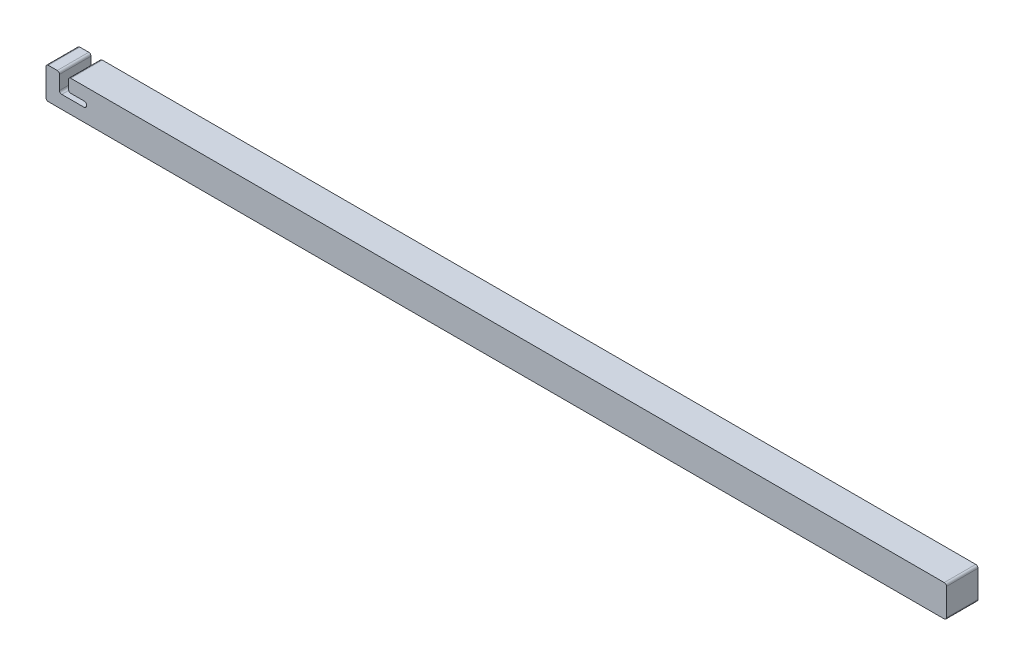
ISO-10303-21;
HEADER;
FILE_DESCRIPTION(('STEP AP214'),'2;1');
FILE_NAME('part.step','',(''),(''),'','','');
FILE_SCHEMA(('AUTOMOTIVE_DESIGN { 1 0 10303 214 1 1 1 1 }'));
ENDSEC;
DATA;
#1=APPLICATION_CONTEXT('core data for automotive mechanical design processes');
#2=APPLICATION_PROTOCOL_DEFINITION('international standard','automotive_design',2000,#1);
#3=PRODUCT_CONTEXT('',#1,'mechanical');
#4=PRODUCT('Part','Part','',(#3));
#5=PRODUCT_RELATED_PRODUCT_CATEGORY('part','',(#4));
#6=PRODUCT_DEFINITION_FORMATION('','',#4);
#7=PRODUCT_DEFINITION_CONTEXT('part definition',#1,'design');
#8=PRODUCT_DEFINITION('design','',#6,#7);
#9=PRODUCT_DEFINITION_SHAPE('','',#8);
#10=(LENGTH_UNIT() NAMED_UNIT(*) SI_UNIT(.MILLI.,.METRE.));
#11=(NAMED_UNIT(*) PLANE_ANGLE_UNIT() SI_UNIT($,.RADIAN.));
#12=(NAMED_UNIT(*) SI_UNIT($,.STERADIAN.) SOLID_ANGLE_UNIT());
#13=UNCERTAINTY_MEASURE_WITH_UNIT(LENGTH_MEASURE(1.E-05),#10,'distance_accuracy_value','');
#14=(GEOMETRIC_REPRESENTATION_CONTEXT(3) GLOBAL_UNCERTAINTY_ASSIGNED_CONTEXT((#13)) GLOBAL_UNIT_ASSIGNED_CONTEXT((#10,
#11,#12)) REPRESENTATION_CONTEXT('',''));
#15=CARTESIAN_POINT('',(0.,0.,0.));
#16=DIRECTION('',(0.,0.,1.));
#17=DIRECTION('',(1.,0.,0.));
#18=AXIS2_PLACEMENT_3D('',#15,#16,#17);
#19=CARTESIAN_POINT('',(-100.,3.5,7.));
#20=DIRECTION('',(0.,-1.,0.));
#21=DIRECTION('',(0.,0.,-1.));
#22=AXIS2_PLACEMENT_3D('',#19,#20,#21);
#23=PLANE('',#22);
#24=DIRECTION('',(-1.,0.,0.));
#25=VECTOR('',#24,1.);
#26=CARTESIAN_POINT('',(-100.,3.5,7.));
#27=LINE('',#26,#25);
#28=CARTESIAN_POINT('',(99.5,3.5,7.));
#29=VERTEX_POINT('',#28);
#30=CARTESIAN_POINT('',(-94.5,3.5,7.));
#31=VERTEX_POINT('',#30);
#32=EDGE_CURVE('E331',#29,#31,#27,.T.);
#33=ORIENTED_EDGE('',*,*,#32,.F.);
#34=DIRECTION('',(0.,0.,-1.));
#35=VECTOR('',#34,1.);
#36=CARTESIAN_POINT('',(99.5,3.5,7.));
#37=LINE('',#36,#35);
#38=CARTESIAN_POINT('',(99.5,3.5,0.));
#39=VERTEX_POINT('',#38);
#40=EDGE_CURVE('E244',#29,#39,#37,.T.);
#41=ORIENTED_EDGE('',*,*,#40,.T.);
#42=DIRECTION('',(-1.,0.,0.));
#43=VECTOR('',#42,1.);
#44=CARTESIAN_POINT('',(-100.,3.5,0.));
#45=LINE('',#44,#43);
#46=CARTESIAN_POINT('',(-94.5,3.5,0.));
#47=VERTEX_POINT('',#46);
#48=EDGE_CURVE('E201',#39,#47,#45,.T.);
#49=ORIENTED_EDGE('',*,*,#48,.T.);
#50=DIRECTION('',(0.,0.,1.));
#51=VECTOR('',#50,1.);
#52=CARTESIAN_POINT('',(-94.5,3.5,7.));
#53=LINE('',#52,#51);
#54=EDGE_CURVE('E241',#47,#31,#53,.T.);
#55=ORIENTED_EDGE('',*,*,#54,.T.);
#56=EDGE_LOOP('',(#33,#41,#49,#55));
#57=FACE_BOUND('',#56,.T.);
#58=ADVANCED_FACE('F33',(#57),#23,.F.);
#59=CARTESIAN_POINT('',(-97.5,3.5,7.));
#60=VERTEX_POINT('',#59);
#61=CARTESIAN_POINT('',(-99.5,3.5,7.));
#62=VERTEX_POINT('',#61);
#63=EDGE_CURVE('E330',#60,#62,#27,.T.);
#64=ORIENTED_EDGE('',*,*,#63,.F.);
#65=DIRECTION('',(0.,0.,1.));
#66=VECTOR('',#65,1.);
#67=CARTESIAN_POINT('',(-97.5,3.5,0.));
#68=LINE('',#67,#66);
#69=CARTESIAN_POINT('',(-97.5,3.5,0.));
#70=VERTEX_POINT('',#69);
#71=EDGE_CURVE('E278',#60,#70,#68,.F.);
#72=ORIENTED_EDGE('',*,*,#71,.T.);
#73=CARTESIAN_POINT('',(-99.5,3.5,0.));
#74=VERTEX_POINT('',#73);
#75=EDGE_CURVE('E197',#70,#74,#45,.T.);
#76=ORIENTED_EDGE('',*,*,#75,.T.);
#77=DIRECTION('',(0.,0.,-1.));
#78=VECTOR('',#77,1.);
#79=CARTESIAN_POINT('',(-99.5,3.5,7.));
#80=LINE('',#79,#78);
#81=EDGE_CURVE('E276',#74,#62,#80,.F.);
#82=ORIENTED_EDGE('',*,*,#81,.T.);
#83=EDGE_LOOP('',(#64,#72,#76,#82));
#84=FACE_BOUND('',#83,.T.);
#85=ADVANCED_FACE('F359',(#84),#23,.F.);
#86=CARTESIAN_POINT('',(0.,0.,7.));
#87=DIRECTION('',(0.,0.,1.));
#88=DIRECTION('',(1.,0.,0.));
#89=AXIS2_PLACEMENT_3D('',#86,#87,#88);
#90=PLANE('',#89);
#91=DIRECTION('',(1.,0.,0.));
#92=VECTOR('',#91,1.);
#93=CARTESIAN_POINT('',(-100.,-3.5,7.));
#94=LINE('',#93,#92);
#95=CARTESIAN_POINT('',(-99.5,-3.5,7.));
#96=VERTEX_POINT('',#95);
#97=CARTESIAN_POINT('',(99.5,-3.5,7.));
#98=VERTEX_POINT('',#97);
#99=EDGE_CURVE('E207',#96,#98,#94,.T.);
#100=ORIENTED_EDGE('',*,*,#99,.T.);
#101=CARTESIAN_POINT('',(99.5,-3.,7.));
#102=DIRECTION('',(0.,0.,1.));
#103=DIRECTION('',(1.,0.,0.));
#104=AXIS2_PLACEMENT_3D('',#101,#102,#103);
#105=CIRCLE('',#104,0.5);
#106=CARTESIAN_POINT('',(100.,-3.,7.));
#107=VERTEX_POINT('',#106);
#108=EDGE_CURVE('E239',#98,#107,#105,.T.);
#109=ORIENTED_EDGE('',*,*,#108,.T.);
#110=DIRECTION('',(0.,1.,0.));
#111=VECTOR('',#110,1.);
#112=CARTESIAN_POINT('',(100.,3.5,7.));
#113=LINE('',#112,#111);
#114=CARTESIAN_POINT('',(100.,3.,7.));
#115=VERTEX_POINT('',#114);
#116=EDGE_CURVE('E191',#107,#115,#113,.T.);
#117=ORIENTED_EDGE('',*,*,#116,.T.);
#118=CARTESIAN_POINT('',(99.5,3.,7.));
#119=DIRECTION('',(0.,0.,1.));
#120=DIRECTION('',(1.,0.,0.));
#121=AXIS2_PLACEMENT_3D('',#118,#119,#120);
#122=CIRCLE('',#121,0.5);
#123=EDGE_CURVE('E237',#115,#29,#122,.T.);
#124=ORIENTED_EDGE('',*,*,#123,.T.);
#125=ORIENTED_EDGE('',*,*,#32,.T.);
#126=CARTESIAN_POINT('',(-94.5,3.,7.));
#127=DIRECTION('',(0.,0.,1.));
#128=DIRECTION('',(1.,0.,0.));
#129=AXIS2_PLACEMENT_3D('',#126,#127,#128);
#130=CIRCLE('',#129,0.5);
#131=CARTESIAN_POINT('',(-95.,3.,7.));
#132=VERTEX_POINT('',#131);
#133=EDGE_CURVE('E231',#31,#132,#130,.T.);
#134=ORIENTED_EDGE('',*,*,#133,.T.);
#135=DIRECTION('',(0.,-1.,0.));
#136=VECTOR('',#135,1.);
#137=CARTESIAN_POINT('',(-95.,0.6,7.));
#138=LINE('',#137,#136);
#139=CARTESIAN_POINT('',(-95.,1.1,7.));
#140=VERTEX_POINT('',#139);
#141=EDGE_CURVE('E319',#132,#140,#138,.T.);
#142=ORIENTED_EDGE('',*,*,#141,.T.);
#143=CARTESIAN_POINT('',(-94.5,1.1,7.));
#144=DIRECTION('',(0.,0.,1.));
#145=DIRECTION('',(1.,0.,0.));
#146=AXIS2_PLACEMENT_3D('',#143,#144,#145);
#147=CIRCLE('',#146,0.5);
#148=CARTESIAN_POINT('',(-94.5,0.6,7.));
#149=VERTEX_POINT('',#148);
#150=EDGE_CURVE('E233',#140,#149,#147,.T.);
#151=ORIENTED_EDGE('',*,*,#150,.T.);
#152=DIRECTION('',(1.,0.,0.));
#153=VECTOR('',#152,1.);
#154=CARTESIAN_POINT('',(-91.,0.599999999999998,7.));
#155=LINE('',#154,#153);
#156=CARTESIAN_POINT('',(-91.5,0.599999999999998,7.));
#157=VERTEX_POINT('',#156);
#158=EDGE_CURVE('E322',#149,#157,#155,.T.);
#159=ORIENTED_EDGE('',*,*,#158,.T.);
#160=CARTESIAN_POINT('',(-91.5,0.0999999999999983,7.));
#161=DIRECTION('',(0.,0.,1.));
#162=DIRECTION('',(1.,0.,0.));
#163=AXIS2_PLACEMENT_3D('',#160,#161,#162);
#164=CIRCLE('',#163,0.5);
#165=CARTESIAN_POINT('',(-91.,0.0999999999999983,7.));
#166=VERTEX_POINT('',#165);
#167=EDGE_CURVE('E280',#157,#166,#164,.F.);
#168=ORIENTED_EDGE('',*,*,#167,.T.);
#169=DIRECTION('',(0.,-1.,0.));
#170=VECTOR('',#169,1.);
#171=CARTESIAN_POINT('',(-91.,-0.600000000000001,7.));
#172=LINE('',#171,#170);
#173=CARTESIAN_POINT('',(-91.,-0.100000000000001,7.));
#174=VERTEX_POINT('',#173);
#175=EDGE_CURVE('E325',#166,#174,#172,.T.);
#176=ORIENTED_EDGE('',*,*,#175,.T.);
#177=CARTESIAN_POINT('',(-91.5,-0.100000000000001,7.));
#178=DIRECTION('',(0.,0.,1.));
#179=DIRECTION('',(1.,0.,0.));
#180=AXIS2_PLACEMENT_3D('',#177,#178,#179);
#181=CIRCLE('',#180,0.5);
#182=CARTESIAN_POINT('',(-91.5,-0.600000000000001,7.));
#183=VERTEX_POINT('',#182);
#184=EDGE_CURVE('E284',#174,#183,#181,.F.);
#185=ORIENTED_EDGE('',*,*,#184,.T.);
#186=DIRECTION('',(-1.,0.,0.));
#187=VECTOR('',#186,1.);
#188=CARTESIAN_POINT('',(-97.,-0.600000000000001,7.));
#189=LINE('',#188,#187);
#190=CARTESIAN_POINT('',(-96.5,-0.600000000000001,7.));
#191=VERTEX_POINT('',#190);
#192=EDGE_CURVE('E294',#183,#191,#189,.T.);
#193=ORIENTED_EDGE('',*,*,#192,.T.);
#194=CARTESIAN_POINT('',(-96.5,-0.100000000000001,7.));
#195=DIRECTION('',(0.,0.,1.));
#196=DIRECTION('',(1.,0.,0.));
#197=AXIS2_PLACEMENT_3D('',#194,#195,#196);
#198=CIRCLE('',#197,0.5);
#199=CARTESIAN_POINT('',(-97.,-0.100000000000001,7.));
#200=VERTEX_POINT('',#199);
#201=EDGE_CURVE('E41',#191,#200,#198,.F.);
#202=ORIENTED_EDGE('',*,*,#201,.T.);
#203=DIRECTION('',(0.,1.,0.));
#204=VECTOR('',#203,1.);
#205=CARTESIAN_POINT('',(-97.,3.5,7.));
#206=LINE('',#205,#204);
#207=CARTESIAN_POINT('',(-97.,3.,7.));
#208=VERTEX_POINT('',#207);
#209=EDGE_CURVE('E292',#200,#208,#206,.T.);
#210=ORIENTED_EDGE('',*,*,#209,.T.);
#211=CARTESIAN_POINT('',(-97.5,3.,7.));
#212=DIRECTION('',(0.,0.,1.));
#213=DIRECTION('',(1.,0.,0.));
#214=AXIS2_PLACEMENT_3D('',#211,#212,#213);
#215=CIRCLE('',#214,0.5);
#216=EDGE_CURVE('E229',#208,#60,#215,.T.);
#217=ORIENTED_EDGE('',*,*,#216,.T.);
#218=ORIENTED_EDGE('',*,*,#63,.T.);
#219=CARTESIAN_POINT('',(-99.5,3.,7.));
#220=DIRECTION('',(0.,0.,1.));
#221=DIRECTION('',(1.,0.,0.));
#222=AXIS2_PLACEMENT_3D('',#219,#220,#221);
#223=CIRCLE('',#222,0.5);
#224=CARTESIAN_POINT('',(-100.,3.,7.));
#225=VERTEX_POINT('',#224);
#226=EDGE_CURVE('E55',#62,#225,#223,.T.);
#227=ORIENTED_EDGE('',*,*,#226,.T.);
#228=DIRECTION('',(0.,-1.,0.));
#229=VECTOR('',#228,1.);
#230=CARTESIAN_POINT('',(-100.,3.5,7.));
#231=LINE('',#230,#229);
#232=CARTESIAN_POINT('',(-100.,-3.,7.));
#233=VERTEX_POINT('',#232);
#234=EDGE_CURVE('E332',#225,#233,#231,.T.);
#235=ORIENTED_EDGE('',*,*,#234,.T.);
#236=CARTESIAN_POINT('',(-99.5,-3.,7.));
#237=DIRECTION('',(0.,0.,1.));
#238=DIRECTION('',(1.,0.,0.));
#239=AXIS2_PLACEMENT_3D('',#236,#237,#238);
#240=CIRCLE('',#239,0.5);
#241=EDGE_CURVE('E235',#233,#96,#240,.T.);
#242=ORIENTED_EDGE('',*,*,#241,.T.);
#243=EDGE_LOOP('',(#100,#109,#117,#124,#125,#134,#142,#151,#159,#168,#176,#185,#193,#202,#210,
#217,#218,#227,#235,#242));
#244=FACE_BOUND('',#243,.T.);
#245=ADVANCED_FACE('F291',(#244),#90,.T.);
#246=CARTESIAN_POINT('',(0.,0.,0.));
#247=DIRECTION('',(0.,0.,1.));
#248=DIRECTION('',(1.,0.,0.));
#249=AXIS2_PLACEMENT_3D('',#246,#247,#248);
#250=PLANE('',#249);
#251=DIRECTION('',(0.,1.,0.));
#252=VECTOR('',#251,1.);
#253=CARTESIAN_POINT('',(100.,3.5,0.));
#254=LINE('',#253,#252);
#255=CARTESIAN_POINT('',(100.,-3.,0.));
#256=VERTEX_POINT('',#255);
#257=CARTESIAN_POINT('',(100.,3.,0.));
#258=VERTEX_POINT('',#257);
#259=EDGE_CURVE('E188',#256,#258,#254,.T.);
#260=ORIENTED_EDGE('',*,*,#259,.F.);
#261=CARTESIAN_POINT('',(99.5,-3.,0.));
#262=DIRECTION('',(0.,0.,1.));
#263=DIRECTION('',(1.,0.,0.));
#264=AXIS2_PLACEMENT_3D('',#261,#262,#263);
#265=CIRCLE('',#264,0.5);
#266=CARTESIAN_POINT('',(99.5,-3.5,0.));
#267=VERTEX_POINT('',#266);
#268=EDGE_CURVE('E171',#256,#267,#265,.F.);
#269=ORIENTED_EDGE('',*,*,#268,.T.);
#270=DIRECTION('',(1.,0.,0.));
#271=VECTOR('',#270,1.);
#272=CARTESIAN_POINT('',(-100.,-3.5,0.));
#273=LINE('',#272,#271);
#274=CARTESIAN_POINT('',(-99.5,-3.5,0.));
#275=VERTEX_POINT('',#274);
#276=EDGE_CURVE('E212',#275,#267,#273,.T.);
#277=ORIENTED_EDGE('',*,*,#276,.F.);
#278=CARTESIAN_POINT('',(-99.5,-3.,0.));
#279=DIRECTION('',(0.,0.,1.));
#280=DIRECTION('',(1.,0.,0.));
#281=AXIS2_PLACEMENT_3D('',#278,#279,#280);
#282=CIRCLE('',#281,0.5);
#283=CARTESIAN_POINT('',(-100.,-3.,0.));
#284=VERTEX_POINT('',#283);
#285=EDGE_CURVE('E222',#275,#284,#282,.F.);
#286=ORIENTED_EDGE('',*,*,#285,.T.);
#287=DIRECTION('',(0.,-1.,0.));
#288=VECTOR('',#287,1.);
#289=CARTESIAN_POINT('',(-100.,3.5,0.));
#290=LINE('',#289,#288);
#291=CARTESIAN_POINT('',(-100.,3.,0.));
#292=VERTEX_POINT('',#291);
#293=EDGE_CURVE('E210',#292,#284,#290,.T.);
#294=ORIENTED_EDGE('',*,*,#293,.F.);
#295=CARTESIAN_POINT('',(-99.5,3.,0.));
#296=DIRECTION('',(0.,0.,1.));
#297=DIRECTION('',(1.,0.,0.));
#298=AXIS2_PLACEMENT_3D('',#295,#296,#297);
#299=CIRCLE('',#298,0.5);
#300=EDGE_CURVE('E192',#292,#74,#299,.F.);
#301=ORIENTED_EDGE('',*,*,#300,.T.);
#302=ORIENTED_EDGE('',*,*,#75,.F.);
#303=CARTESIAN_POINT('',(-97.5,3.,0.));
#304=DIRECTION('',(0.,0.,1.));
#305=DIRECTION('',(1.,0.,0.));
#306=AXIS2_PLACEMENT_3D('',#303,#304,#305);
#307=CIRCLE('',#306,0.5);
#308=CARTESIAN_POINT('',(-97.,3.,0.));
#309=VERTEX_POINT('',#308);
#310=EDGE_CURVE('E216',#70,#309,#307,.F.);
#311=ORIENTED_EDGE('',*,*,#310,.T.);
#312=DIRECTION('',(0.,1.,0.));
#313=VECTOR('',#312,1.);
#314=CARTESIAN_POINT('',(-97.,3.5,0.));
#315=LINE('',#314,#313);
#316=CARTESIAN_POINT('',(-97.,-0.100000000000001,0.));
#317=VERTEX_POINT('',#316);
#318=EDGE_CURVE('E198',#317,#309,#315,.T.);
#319=ORIENTED_EDGE('',*,*,#318,.F.);
#320=CARTESIAN_POINT('',(-96.5,-0.100000000000001,0.));
#321=DIRECTION('',(0.,0.,1.));
#322=DIRECTION('',(1.,0.,0.));
#323=AXIS2_PLACEMENT_3D('',#320,#321,#322);
#324=CIRCLE('',#323,0.5);
#325=CARTESIAN_POINT('',(-96.5,-0.600000000000001,0.));
#326=VERTEX_POINT('',#325);
#327=EDGE_CURVE('E11',#317,#326,#324,.T.);
#328=ORIENTED_EDGE('',*,*,#327,.T.);
#329=DIRECTION('',(-1.,0.,0.));
#330=VECTOR('',#329,1.);
#331=CARTESIAN_POINT('',(-97.,-0.600000000000001,0.));
#332=LINE('',#331,#330);
#333=CARTESIAN_POINT('',(-91.5,-0.600000000000001,0.));
#334=VERTEX_POINT('',#333);
#335=EDGE_CURVE('E204',#334,#326,#332,.T.);
#336=ORIENTED_EDGE('',*,*,#335,.F.);
#337=CARTESIAN_POINT('',(-91.5,-0.100000000000001,0.));
#338=DIRECTION('',(0.,0.,1.));
#339=DIRECTION('',(1.,0.,0.));
#340=AXIS2_PLACEMENT_3D('',#337,#338,#339);
#341=CIRCLE('',#340,0.5);
#342=CARTESIAN_POINT('',(-91.,-0.100000000000001,0.));
#343=VERTEX_POINT('',#342);
#344=EDGE_CURVE('E286',#334,#343,#341,.T.);
#345=ORIENTED_EDGE('',*,*,#344,.T.);
#346=DIRECTION('',(0.,-1.,0.));
#347=VECTOR('',#346,1.);
#348=CARTESIAN_POINT('',(-91.,-0.600000000000001,0.));
#349=LINE('',#348,#347);
#350=CARTESIAN_POINT('',(-91.,0.0999999999999983,0.));
#351=VERTEX_POINT('',#350);
#352=EDGE_CURVE('E312',#351,#343,#349,.T.);
#353=ORIENTED_EDGE('',*,*,#352,.F.);
#354=CARTESIAN_POINT('',(-91.5,0.0999999999999983,0.));
#355=DIRECTION('',(0.,0.,1.));
#356=DIRECTION('',(1.,0.,0.));
#357=AXIS2_PLACEMENT_3D('',#354,#355,#356);
#358=CIRCLE('',#357,0.5);
#359=CARTESIAN_POINT('',(-91.5,0.599999999999998,0.));
#360=VERTEX_POINT('',#359);
#361=EDGE_CURVE('E282',#351,#360,#358,.T.);
#362=ORIENTED_EDGE('',*,*,#361,.T.);
#363=DIRECTION('',(1.,0.,0.));
#364=VECTOR('',#363,1.);
#365=CARTESIAN_POINT('',(-91.,0.599999999999998,0.));
#366=LINE('',#365,#364);
#367=CARTESIAN_POINT('',(-94.5,0.6,0.));
#368=VERTEX_POINT('',#367);
#369=EDGE_CURVE('E315',#368,#360,#366,.T.);
#370=ORIENTED_EDGE('',*,*,#369,.F.);
#371=CARTESIAN_POINT('',(-94.5,1.1,0.));
#372=DIRECTION('',(0.,0.,1.));
#373=DIRECTION('',(1.,0.,0.));
#374=AXIS2_PLACEMENT_3D('',#371,#372,#373);
#375=CIRCLE('',#374,0.5);
#376=CARTESIAN_POINT('',(-95.,1.1,0.));
#377=VERTEX_POINT('',#376);
#378=EDGE_CURVE('E220',#368,#377,#375,.F.);
#379=ORIENTED_EDGE('',*,*,#378,.T.);
#380=DIRECTION('',(0.,-1.,0.));
#381=VECTOR('',#380,1.);
#382=CARTESIAN_POINT('',(-95.,0.6,0.));
#383=LINE('',#382,#381);
#384=CARTESIAN_POINT('',(-95.,3.,0.));
#385=VERTEX_POINT('',#384);
#386=EDGE_CURVE('E302',#385,#377,#383,.T.);
#387=ORIENTED_EDGE('',*,*,#386,.F.);
#388=CARTESIAN_POINT('',(-94.5,3.,0.));
#389=DIRECTION('',(0.,0.,1.));
#390=DIRECTION('',(1.,0.,0.));
#391=AXIS2_PLACEMENT_3D('',#388,#389,#390);
#392=CIRCLE('',#391,0.5);
#393=EDGE_CURVE('E218',#385,#47,#392,.F.);
#394=ORIENTED_EDGE('',*,*,#393,.T.);
#395=ORIENTED_EDGE('',*,*,#48,.F.);
#396=CARTESIAN_POINT('',(99.5,3.,0.));
#397=DIRECTION('',(0.,0.,1.));
#398=DIRECTION('',(1.,0.,0.));
#399=AXIS2_PLACEMENT_3D('',#396,#397,#398);
#400=CIRCLE('',#399,0.5);
#401=EDGE_CURVE('E182',#39,#258,#400,.F.);
#402=ORIENTED_EDGE('',*,*,#401,.T.);
#403=EDGE_LOOP('',(#260,#269,#277,#286,#294,#301,#302,#311,#319,#328,#336,#345,#353,#362,#370,
#379,#387,#394,#395,#402));
#404=FACE_BOUND('',#403,.T.);
#405=ADVANCED_FACE('F195',(#404),#250,.F.);
#406=CARTESIAN_POINT('',(100.,3.5,7.));
#407=DIRECTION('',(-1.,0.,0.));
#408=DIRECTION('',(0.,0.,1.));
#409=AXIS2_PLACEMENT_3D('',#406,#407,#408);
#410=PLANE('',#409);
#411=ORIENTED_EDGE('',*,*,#116,.F.);
#412=DIRECTION('',(0.,0.,-1.));
#413=VECTOR('',#412,1.);
#414=CARTESIAN_POINT('',(100.,-3.,7.));
#415=LINE('',#414,#413);
#416=EDGE_CURVE('E175',#107,#256,#415,.T.);
#417=ORIENTED_EDGE('',*,*,#416,.T.);
#418=ORIENTED_EDGE('',*,*,#259,.T.);
#419=DIRECTION('',(0.,0.,-1.));
#420=VECTOR('',#419,1.);
#421=CARTESIAN_POINT('',(100.,3.,7.));
#422=LINE('',#421,#420);
#423=EDGE_CURVE('E193',#258,#115,#422,.F.);
#424=ORIENTED_EDGE('',*,*,#423,.T.);
#425=EDGE_LOOP('',(#411,#417,#418,#424));
#426=FACE_BOUND('',#425,.T.);
#427=ADVANCED_FACE('F187',(#426),#410,.F.);
#428=CARTESIAN_POINT('',(-100.,3.5,7.));
#429=DIRECTION('',(1.,0.,0.));
#430=DIRECTION('',(0.,0.,-1.));
#431=AXIS2_PLACEMENT_3D('',#428,#429,#430);
#432=PLANE('',#431);
#433=ORIENTED_EDGE('',*,*,#293,.T.);
#434=DIRECTION('',(0.,0.,-1.));
#435=VECTOR('',#434,1.);
#436=CARTESIAN_POINT('',(-100.,-3.,7.));
#437=LINE('',#436,#435);
#438=EDGE_CURVE('E48',#284,#233,#437,.F.);
#439=ORIENTED_EDGE('',*,*,#438,.T.);
#440=ORIENTED_EDGE('',*,*,#234,.F.);
#441=DIRECTION('',(0.,0.,-1.));
#442=VECTOR('',#441,1.);
#443=CARTESIAN_POINT('',(-100.,3.,7.));
#444=LINE('',#443,#442);
#445=EDGE_CURVE('E247',#225,#292,#444,.T.);
#446=ORIENTED_EDGE('',*,*,#445,.T.);
#447=EDGE_LOOP('',(#433,#439,#440,#446));
#448=FACE_BOUND('',#447,.T.);
#449=ADVANCED_FACE('F351',(#448),#432,.F.);
#450=CARTESIAN_POINT('',(-100.,-3.5,7.));
#451=DIRECTION('',(0.,1.,0.));
#452=DIRECTION('',(0.,0.,1.));
#453=AXIS2_PLACEMENT_3D('',#450,#451,#452);
#454=PLANE('',#453);
#455=ORIENTED_EDGE('',*,*,#276,.T.);
#456=DIRECTION('',(0.,0.,-1.));
#457=VECTOR('',#456,1.);
#458=CARTESIAN_POINT('',(99.5,-3.5,7.));
#459=LINE('',#458,#457);
#460=EDGE_CURVE('E176',#267,#98,#459,.F.);
#461=ORIENTED_EDGE('',*,*,#460,.T.);
#462=ORIENTED_EDGE('',*,*,#99,.F.);
#463=DIRECTION('',(0.,0.,-1.));
#464=VECTOR('',#463,1.);
#465=CARTESIAN_POINT('',(-99.5,-3.5,7.));
#466=LINE('',#465,#464);
#467=EDGE_CURVE('E181',#96,#275,#466,.T.);
#468=ORIENTED_EDGE('',*,*,#467,.T.);
#469=EDGE_LOOP('',(#455,#461,#462,#468));
#470=FACE_BOUND('',#469,.T.);
#471=ADVANCED_FACE('F347',(#470),#454,.F.);
#472=CARTESIAN_POINT('',(-95.,0.6,0.));
#473=DIRECTION('',(-1.,0.,0.));
#474=DIRECTION('',(0.,0.,1.));
#475=AXIS2_PLACEMENT_3D('',#472,#473,#474);
#476=PLANE('',#475);
#477=ORIENTED_EDGE('',*,*,#386,.T.);
#478=DIRECTION('',(0.,0.,1.));
#479=VECTOR('',#478,1.);
#480=CARTESIAN_POINT('',(-95.,1.1,0.));
#481=LINE('',#480,#479);
#482=EDGE_CURVE('E253',#377,#140,#481,.T.);
#483=ORIENTED_EDGE('',*,*,#482,.T.);
#484=ORIENTED_EDGE('',*,*,#141,.F.);
#485=DIRECTION('',(0.,0.,1.));
#486=VECTOR('',#485,1.);
#487=CARTESIAN_POINT('',(-95.,3.,0.));
#488=LINE('',#487,#486);
#489=EDGE_CURVE('E251',#132,#385,#488,.F.);
#490=ORIENTED_EDGE('',*,*,#489,.T.);
#491=EDGE_LOOP('',(#477,#483,#484,#490));
#492=FACE_BOUND('',#491,.T.);
#493=ADVANCED_FACE('F483',(#492),#476,.T.);
#494=CARTESIAN_POINT('',(-91.,0.599999999999998,0.));
#495=DIRECTION('',(0.,-1.,0.));
#496=DIRECTION('',(1.,0.,0.));
#497=AXIS2_PLACEMENT_3D('',#494,#495,#496);
#498=PLANE('',#497);
#499=ORIENTED_EDGE('',*,*,#158,.F.);
#500=DIRECTION('',(0.,0.,1.));
#501=VECTOR('',#500,1.);
#502=CARTESIAN_POINT('',(-94.5,0.6,0.));
#503=LINE('',#502,#501);
#504=EDGE_CURVE('E259',#149,#368,#503,.F.);
#505=ORIENTED_EDGE('',*,*,#504,.T.);
#506=ORIENTED_EDGE('',*,*,#369,.T.);
#507=DIRECTION('',(0.,0.,1.));
#508=VECTOR('',#507,1.);
#509=CARTESIAN_POINT('',(-91.5,0.599999999999998,7.));
#510=LINE('',#509,#508);
#511=EDGE_CURVE('E256',#360,#157,#510,.T.);
#512=ORIENTED_EDGE('',*,*,#511,.T.);
#513=EDGE_LOOP('',(#499,#505,#506,#512));
#514=FACE_BOUND('',#513,.T.);
#515=ADVANCED_FACE('F474',(#514),#498,.T.);
#516=CARTESIAN_POINT('',(-91.,-0.600000000000001,0.));
#517=DIRECTION('',(-1.,0.,0.));
#518=DIRECTION('',(0.,0.,1.));
#519=AXIS2_PLACEMENT_3D('',#516,#517,#518);
#520=PLANE('',#519);
#521=ORIENTED_EDGE('',*,*,#175,.F.);
#522=DIRECTION('',(0.,0.,1.));
#523=VECTOR('',#522,1.);
#524=CARTESIAN_POINT('',(-91.,0.0999999999999983,0.));
#525=LINE('',#524,#523);
#526=EDGE_CURVE('E264',#166,#351,#525,.F.);
#527=ORIENTED_EDGE('',*,*,#526,.T.);
#528=ORIENTED_EDGE('',*,*,#352,.T.);
#529=DIRECTION('',(0.,0.,1.));
#530=VECTOR('',#529,1.);
#531=CARTESIAN_POINT('',(-91.,-0.100000000000001,7.));
#532=LINE('',#531,#530);
#533=EDGE_CURVE('E261',#343,#174,#532,.T.);
#534=ORIENTED_EDGE('',*,*,#533,.T.);
#535=EDGE_LOOP('',(#521,#527,#528,#534));
#536=FACE_BOUND('',#535,.T.);
#537=ADVANCED_FACE('F466',(#536),#520,.T.);
#538=CARTESIAN_POINT('',(-97.,-0.600000000000001,0.));
#539=DIRECTION('',(0.,1.,0.));
#540=DIRECTION('',(-1.,0.,0.));
#541=AXIS2_PLACEMENT_3D('',#538,#539,#540);
#542=PLANE('',#541);
#543=ORIENTED_EDGE('',*,*,#192,.F.);
#544=DIRECTION('',(0.,0.,1.));
#545=VECTOR('',#544,1.);
#546=CARTESIAN_POINT('',(-91.5,-0.600000000000001,0.));
#547=LINE('',#546,#545);
#548=EDGE_CURVE('E269',#183,#334,#547,.F.);
#549=ORIENTED_EDGE('',*,*,#548,.T.);
#550=ORIENTED_EDGE('',*,*,#335,.T.);
#551=DIRECTION('',(0.,0.,1.));
#552=VECTOR('',#551,1.);
#553=CARTESIAN_POINT('',(-96.5,-0.600000000000001,7.));
#554=LINE('',#553,#552);
#555=EDGE_CURVE('E266',#326,#191,#554,.T.);
#556=ORIENTED_EDGE('',*,*,#555,.T.);
#557=EDGE_LOOP('',(#543,#549,#550,#556));
#558=FACE_BOUND('',#557,.T.);
#559=ADVANCED_FACE('F310',(#558),#542,.T.);
#560=CARTESIAN_POINT('',(-97.,3.5,0.));
#561=DIRECTION('',(1.,0.,0.));
#562=DIRECTION('',(0.,0.,-1.));
#563=AXIS2_PLACEMENT_3D('',#560,#561,#562);
#564=PLANE('',#563);
#565=ORIENTED_EDGE('',*,*,#209,.F.);
#566=DIRECTION('',(0.,0.,1.));
#567=VECTOR('',#566,1.);
#568=CARTESIAN_POINT('',(-97.,-0.100000000000001,0.));
#569=LINE('',#568,#567);
#570=EDGE_CURVE('E274',#200,#317,#569,.F.);
#571=ORIENTED_EDGE('',*,*,#570,.T.);
#572=ORIENTED_EDGE('',*,*,#318,.T.);
#573=DIRECTION('',(0.,0.,1.));
#574=VECTOR('',#573,1.);
#575=CARTESIAN_POINT('',(-97.,3.,7.));
#576=LINE('',#575,#574);
#577=EDGE_CURVE('E271',#309,#208,#576,.T.);
#578=ORIENTED_EDGE('',*,*,#577,.T.);
#579=EDGE_LOOP('',(#565,#571,#572,#578));
#580=FACE_BOUND('',#579,.T.);
#581=ADVANCED_FACE('F299',(#580),#564,.T.);
#582=CARTESIAN_POINT('',(99.5,-3.,7.));
#583=DIRECTION('',(0.,0.,-1.));
#584=DIRECTION('',(-1.,0.,0.));
#585=AXIS2_PLACEMENT_3D('',#582,#583,#584);
#586=CYLINDRICAL_SURFACE('',#585,0.5);
#587=ORIENTED_EDGE('',*,*,#108,.F.);
#588=ORIENTED_EDGE('',*,*,#460,.F.);
#589=ORIENTED_EDGE('',*,*,#268,.F.);
#590=ORIENTED_EDGE('',*,*,#416,.F.);
#591=EDGE_LOOP('',(#587,#588,#589,#590));
#592=FACE_BOUND('',#591,.T.);
#593=ADVANCED_FACE('F174',(#592),#586,.T.);
#594=CARTESIAN_POINT('',(99.5,3.,7.));
#595=DIRECTION('',(0.,0.,-1.));
#596=DIRECTION('',(-1.,0.,0.));
#597=AXIS2_PLACEMENT_3D('',#594,#595,#596);
#598=CYLINDRICAL_SURFACE('',#597,0.5);
#599=ORIENTED_EDGE('',*,*,#123,.F.);
#600=ORIENTED_EDGE('',*,*,#423,.F.);
#601=ORIENTED_EDGE('',*,*,#401,.F.);
#602=ORIENTED_EDGE('',*,*,#40,.F.);
#603=EDGE_LOOP('',(#599,#600,#601,#602));
#604=FACE_BOUND('',#603,.T.);
#605=ADVANCED_FACE('F343',(#604),#598,.T.);
#606=CARTESIAN_POINT('',(-99.5,-3.,7.));
#607=DIRECTION('',(0.,0.,-1.));
#608=DIRECTION('',(-1.,0.,0.));
#609=AXIS2_PLACEMENT_3D('',#606,#607,#608);
#610=CYLINDRICAL_SURFACE('',#609,0.5);
#611=ORIENTED_EDGE('',*,*,#241,.F.);
#612=ORIENTED_EDGE('',*,*,#438,.F.);
#613=ORIENTED_EDGE('',*,*,#285,.F.);
#614=ORIENTED_EDGE('',*,*,#467,.F.);
#615=EDGE_LOOP('',(#611,#612,#613,#614));
#616=FACE_BOUND('',#615,.T.);
#617=ADVANCED_FACE('F349',(#616),#610,.T.);
#618=CARTESIAN_POINT('',(-94.5,1.1,0.));
#619=DIRECTION('',(0.,0.,1.));
#620=DIRECTION('',(1.,0.,0.));
#621=AXIS2_PLACEMENT_3D('',#618,#619,#620);
#622=CYLINDRICAL_SURFACE('',#621,0.5);
#623=ORIENTED_EDGE('',*,*,#378,.F.);
#624=ORIENTED_EDGE('',*,*,#504,.F.);
#625=ORIENTED_EDGE('',*,*,#150,.F.);
#626=ORIENTED_EDGE('',*,*,#482,.F.);
#627=EDGE_LOOP('',(#623,#624,#625,#626));
#628=FACE_BOUND('',#627,.T.);
#629=ADVANCED_FACE('F387',(#628),#622,.T.);
#630=CARTESIAN_POINT('',(-91.5,0.0999999999999983,0.));
#631=DIRECTION('',(0.,0.,-1.));
#632=DIRECTION('',(-1.,0.,0.));
#633=AXIS2_PLACEMENT_3D('',#630,#631,#632);
#634=CYLINDRICAL_SURFACE('',#633,0.5);
#635=ORIENTED_EDGE('',*,*,#361,.F.);
#636=ORIENTED_EDGE('',*,*,#526,.F.);
#637=ORIENTED_EDGE('',*,*,#167,.F.);
#638=ORIENTED_EDGE('',*,*,#511,.F.);
#639=EDGE_LOOP('',(#635,#636,#637,#638));
#640=FACE_BOUND('',#639,.T.);
#641=ADVANCED_FACE('F390',(#640),#634,.F.);
#642=CARTESIAN_POINT('',(-91.5,-0.100000000000001,0.));
#643=DIRECTION('',(0.,0.,-1.));
#644=DIRECTION('',(-1.,0.,0.));
#645=AXIS2_PLACEMENT_3D('',#642,#643,#644);
#646=CYLINDRICAL_SURFACE('',#645,0.5);
#647=ORIENTED_EDGE('',*,*,#344,.F.);
#648=ORIENTED_EDGE('',*,*,#548,.F.);
#649=ORIENTED_EDGE('',*,*,#184,.F.);
#650=ORIENTED_EDGE('',*,*,#533,.F.);
#651=EDGE_LOOP('',(#647,#648,#649,#650));
#652=FACE_BOUND('',#651,.T.);
#653=ADVANCED_FACE('F394',(#652),#646,.F.);
#654=CARTESIAN_POINT('',(-96.5,-0.100000000000001,0.));
#655=DIRECTION('',(0.,0.,-1.));
#656=DIRECTION('',(-1.,0.,0.));
#657=AXIS2_PLACEMENT_3D('',#654,#655,#656);
#658=CYLINDRICAL_SURFACE('',#657,0.5);
#659=ORIENTED_EDGE('',*,*,#327,.F.);
#660=ORIENTED_EDGE('',*,*,#570,.F.);
#661=ORIENTED_EDGE('',*,*,#201,.F.);
#662=ORIENTED_EDGE('',*,*,#555,.F.);
#663=EDGE_LOOP('',(#659,#660,#661,#662));
#664=FACE_BOUND('',#663,.T.);
#665=ADVANCED_FACE('F305',(#664),#658,.F.);
#666=CARTESIAN_POINT('',(-94.5,3.,7.));
#667=DIRECTION('',(0.,0.,-1.));
#668=DIRECTION('',(-1.,0.,0.));
#669=AXIS2_PLACEMENT_3D('',#666,#667,#668);
#670=CYLINDRICAL_SURFACE('',#669,0.5);
#671=ORIENTED_EDGE('',*,*,#393,.F.);
#672=ORIENTED_EDGE('',*,*,#489,.F.);
#673=ORIENTED_EDGE('',*,*,#133,.F.);
#674=ORIENTED_EDGE('',*,*,#54,.F.);
#675=EDGE_LOOP('',(#671,#672,#673,#674));
#676=FACE_BOUND('',#675,.T.);
#677=ADVANCED_FACE('F364',(#676),#670,.T.);
#678=CARTESIAN_POINT('',(-97.5,3.,0.));
#679=DIRECTION('',(0.,0.,-1.));
#680=DIRECTION('',(-1.,0.,0.));
#681=AXIS2_PLACEMENT_3D('',#678,#679,#680);
#682=CYLINDRICAL_SURFACE('',#681,0.5);
#683=ORIENTED_EDGE('',*,*,#310,.F.);
#684=ORIENTED_EDGE('',*,*,#71,.F.);
#685=ORIENTED_EDGE('',*,*,#216,.F.);
#686=ORIENTED_EDGE('',*,*,#577,.F.);
#687=EDGE_LOOP('',(#683,#684,#685,#686));
#688=FACE_BOUND('',#687,.T.);
#689=ADVANCED_FACE('F362',(#688),#682,.T.);
#690=CARTESIAN_POINT('',(-99.5,3.,7.));
#691=DIRECTION('',(0.,0.,-1.));
#692=DIRECTION('',(-1.,0.,0.));
#693=AXIS2_PLACEMENT_3D('',#690,#691,#692);
#694=CYLINDRICAL_SURFACE('',#693,0.5);
#695=ORIENTED_EDGE('',*,*,#226,.F.);
#696=ORIENTED_EDGE('',*,*,#81,.F.);
#697=ORIENTED_EDGE('',*,*,#300,.F.);
#698=ORIENTED_EDGE('',*,*,#445,.F.);
#699=EDGE_LOOP('',(#695,#696,#697,#698));
#700=FACE_BOUND('',#699,.T.);
#701=ADVANCED_FACE('F35',(#700),#694,.T.);
#702=CLOSED_SHELL('',(#58,#85,#245,#405,#427,#449,#471,#493,#515,#537,#559,#581,#593,#605,#617,
#629,#641,#653,#665,#677,#689,#701));
#703=MANIFOLD_SOLID_BREP('B2',#702);
#704=ADVANCED_BREP_SHAPE_REPRESENTATION('',(#18,#703),#14);
#705=SHAPE_DEFINITION_REPRESENTATION(#9,#704);
ENDSEC;
END-ISO-10303-21;
